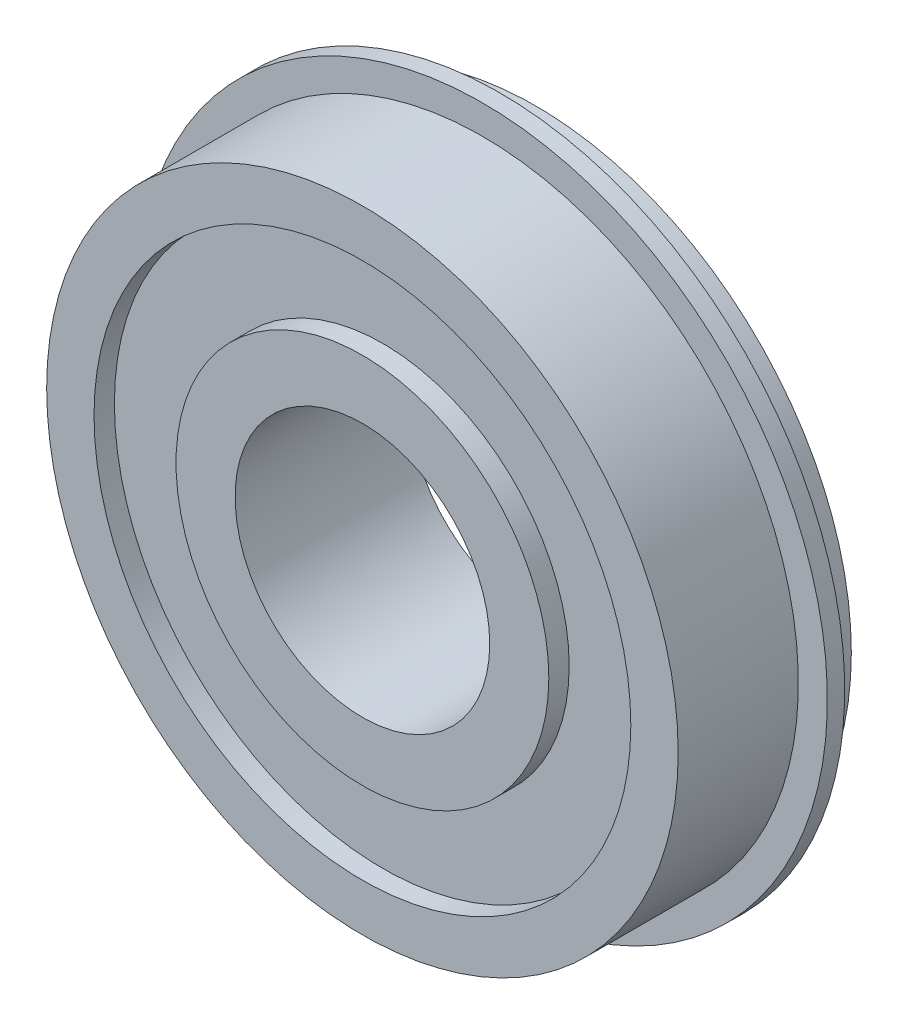
ISO-10303-21;
HEADER;
FILE_DESCRIPTION(('STEP AP214'),'2;1');
FILE_NAME('part.step','',(''),(''),'','','');
FILE_SCHEMA(('AUTOMOTIVE_DESIGN { 1 0 10303 214 1 1 1 1 }'));
ENDSEC;
DATA;
#1=APPLICATION_CONTEXT('core data for automotive mechanical design processes');
#2=APPLICATION_PROTOCOL_DEFINITION('international standard','automotive_design',2000,#1);
#3=PRODUCT_CONTEXT('',#1,'mechanical');
#4=PRODUCT('Part','Part','',(#3));
#5=PRODUCT_RELATED_PRODUCT_CATEGORY('part','',(#4));
#6=PRODUCT_DEFINITION_FORMATION('','',#4);
#7=PRODUCT_DEFINITION_CONTEXT('part definition',#1,'design');
#8=PRODUCT_DEFINITION('design','',#6,#7);
#9=PRODUCT_DEFINITION_SHAPE('','',#8);
#10=(LENGTH_UNIT() NAMED_UNIT(*) SI_UNIT(.MILLI.,.METRE.));
#11=(NAMED_UNIT(*) PLANE_ANGLE_UNIT() SI_UNIT($,.RADIAN.));
#12=(NAMED_UNIT(*) SI_UNIT($,.STERADIAN.) SOLID_ANGLE_UNIT());
#13=UNCERTAINTY_MEASURE_WITH_UNIT(LENGTH_MEASURE(1.E-05),#10,'distance_accuracy_value','');
#14=(GEOMETRIC_REPRESENTATION_CONTEXT(3) GLOBAL_UNCERTAINTY_ASSIGNED_CONTEXT((#13)) GLOBAL_UNIT_ASSIGNED_CONTEXT((#10,
#11,#12)) REPRESENTATION_CONTEXT('',''));
#15=CARTESIAN_POINT('',(0.,0.,0.));
#16=DIRECTION('',(0.,0.,1.));
#17=DIRECTION('',(1.,0.,0.));
#18=AXIS2_PLACEMENT_3D('',#15,#16,#17);
#19=CARTESIAN_POINT('',(0.,0.,8.5));
#20=DIRECTION('',(0.,0.,-1.));
#21=DIRECTION('',(-1.,0.,0.));
#22=AXIS2_PLACEMENT_3D('',#19,#20,#21);
#23=CYLINDRICAL_SURFACE('',#22,31.);
#24=CARTESIAN_POINT('',(0.,0.,8.5));
#25=DIRECTION('',(0.,0.,1.));
#26=DIRECTION('',(1.,0.,0.));
#27=AXIS2_PLACEMENT_3D('',#24,#25,#26);
#28=CIRCLE('',#27,31.);
#29=CARTESIAN_POINT('',(31.,0.,8.5));
#30=VERTEX_POINT('',#29);
#31=EDGE_CURVE('E43',#30,#30,#28,.T.);
#32=ORIENTED_EDGE('',*,*,#31,.F.);
#33=EDGE_LOOP('',(#32));
#34=FACE_BOUND('',#33,.T.);
#35=CARTESIAN_POINT('',(0.,0.,-3.3));
#36=DIRECTION('',(0.,0.,-1.));
#37=DIRECTION('',(-1.,0.,0.));
#38=AXIS2_PLACEMENT_3D('',#35,#36,#37);
#39=CIRCLE('',#38,31.);
#40=CARTESIAN_POINT('',(-31.,0.,-3.3));
#41=VERTEX_POINT('',#40);
#42=EDGE_CURVE('E10',#41,#41,#39,.T.);
#43=ORIENTED_EDGE('',*,*,#42,.F.);
#44=EDGE_LOOP('',(#43));
#45=FACE_BOUND('',#44,.T.);
#46=ADVANCED_FACE('F36',(#34,#45),#23,.T.);
#47=CARTESIAN_POINT('',(0.,0.,-8.5));
#48=DIRECTION('',(0.,0.,1.));
#49=DIRECTION('',(1.,0.,0.));
#50=AXIS2_PLACEMENT_3D('',#47,#48,#49);
#51=PLANE('',#50);
#52=CARTESIAN_POINT('',(0.,0.,-8.5));
#53=DIRECTION('',(0.,0.,1.));
#54=DIRECTION('',(1.,0.,0.));
#55=AXIS2_PLACEMENT_3D('',#52,#53,#54);
#56=CIRCLE('',#55,12.5);
#57=CARTESIAN_POINT('',(12.5,0.,-8.5));
#58=VERTEX_POINT('',#57);
#59=EDGE_CURVE('E54',#58,#58,#56,.T.);
#60=ORIENTED_EDGE('',*,*,#59,.T.);
#61=EDGE_LOOP('',(#60));
#62=FACE_BOUND('',#61,.T.);
#63=CARTESIAN_POINT('',(0.,0.,-8.5));
#64=DIRECTION('',(0.,0.,1.));
#65=DIRECTION('',(1.,0.,0.));
#66=AXIS2_PLACEMENT_3D('',#63,#64,#65);
#67=CIRCLE('',#66,18.3);
#68=CARTESIAN_POINT('',(18.3,0.,-8.5));
#69=VERTEX_POINT('',#68);
#70=EDGE_CURVE('E78',#69,#69,#67,.T.);
#71=ORIENTED_EDGE('',*,*,#70,.F.);
#72=EDGE_LOOP('',(#71));
#73=FACE_BOUND('',#72,.T.);
#74=ADVANCED_FACE('F116',(#62,#73),#51,.F.);
#75=CARTESIAN_POINT('',(0.,0.,8.5));
#76=DIRECTION('',(0.,0.,1.));
#77=DIRECTION('',(1.,0.,0.));
#78=AXIS2_PLACEMENT_3D('',#75,#76,#77);
#79=PLANE('',#78);
#80=CARTESIAN_POINT('',(0.,0.,8.5));
#81=DIRECTION('',(0.,0.,1.));
#82=DIRECTION('',(1.,0.,0.));
#83=AXIS2_PLACEMENT_3D('',#80,#81,#82);
#84=CIRCLE('',#83,12.5);
#85=CARTESIAN_POINT('',(12.5,0.,8.5));
#86=VERTEX_POINT('',#85);
#87=EDGE_CURVE('E52',#86,#86,#84,.T.);
#88=ORIENTED_EDGE('',*,*,#87,.F.);
#89=EDGE_LOOP('',(#88));
#90=FACE_BOUND('',#89,.T.);
#91=CARTESIAN_POINT('',(0.,0.,8.5));
#92=DIRECTION('',(0.,0.,1.));
#93=DIRECTION('',(1.,0.,0.));
#94=AXIS2_PLACEMENT_3D('',#91,#92,#93);
#95=CIRCLE('',#94,18.3);
#96=CARTESIAN_POINT('',(18.3,0.,8.5));
#97=VERTEX_POINT('',#96);
#98=EDGE_CURVE('E66',#97,#97,#95,.T.);
#99=ORIENTED_EDGE('',*,*,#98,.T.);
#100=EDGE_LOOP('',(#99));
#101=FACE_BOUND('',#100,.T.);
#102=ADVANCED_FACE('F121',(#90,#101),#79,.T.);
#103=CARTESIAN_POINT('',(0.,0.,8.5));
#104=DIRECTION('',(0.,0.,1.));
#105=DIRECTION('',(1.,0.,0.));
#106=AXIS2_PLACEMENT_3D('',#103,#104,#105);
#107=CIRCLE('',#106,26.35);
#108=CARTESIAN_POINT('',(26.35,0.,8.5));
#109=VERTEX_POINT('',#108);
#110=EDGE_CURVE('E60',#109,#109,#107,.T.);
#111=ORIENTED_EDGE('',*,*,#110,.F.);
#112=EDGE_LOOP('',(#111));
#113=FACE_BOUND('',#112,.T.);
#114=ORIENTED_EDGE('',*,*,#31,.T.);
#115=EDGE_LOOP('',(#114));
#116=FACE_BOUND('',#115,.T.);
#117=ADVANCED_FACE('F134',(#113,#116),#79,.T.);
#118=CARTESIAN_POINT('',(0.,0.,-8.5));
#119=DIRECTION('',(0.,0.,1.));
#120=DIRECTION('',(1.,0.,0.));
#121=AXIS2_PLACEMENT_3D('',#118,#119,#120);
#122=CIRCLE('',#121,26.35);
#123=CARTESIAN_POINT('',(26.35,0.,-8.5));
#124=VERTEX_POINT('',#123);
#125=EDGE_CURVE('E72',#124,#124,#122,.T.);
#126=ORIENTED_EDGE('',*,*,#125,.T.);
#127=EDGE_LOOP('',(#126));
#128=FACE_BOUND('',#127,.T.);
#129=CARTESIAN_POINT('',(0.,0.,-8.5));
#130=DIRECTION('',(0.,0.,1.));
#131=DIRECTION('',(1.,0.,0.));
#132=AXIS2_PLACEMENT_3D('',#129,#130,#131);
#133=CIRCLE('',#132,31.);
#134=CARTESIAN_POINT('',(31.,0.,-8.5));
#135=VERTEX_POINT('',#134);
#136=EDGE_CURVE('E47',#135,#135,#133,.T.);
#137=ORIENTED_EDGE('',*,*,#136,.F.);
#138=EDGE_LOOP('',(#137));
#139=FACE_BOUND('',#138,.T.);
#140=ADVANCED_FACE('F123',(#128,#139),#51,.F.);
#141=CARTESIAN_POINT('',(0.,0.,-5.));
#142=DIRECTION('',(0.,0.,-1.));
#143=DIRECTION('',(-1.,0.,0.));
#144=AXIS2_PLACEMENT_3D('',#141,#142,#143);
#145=CIRCLE('',#144,31.);
#146=CARTESIAN_POINT('',(-31.,0.,-5.));
#147=VERTEX_POINT('',#146);
#148=EDGE_CURVE('E87',#147,#147,#145,.T.);
#149=ORIENTED_EDGE('',*,*,#148,.T.);
#150=EDGE_LOOP('',(#149));
#151=FACE_BOUND('',#150,.T.);
#152=ORIENTED_EDGE('',*,*,#136,.T.);
#153=EDGE_LOOP('',(#152));
#154=FACE_BOUND('',#153,.T.);
#155=ADVANCED_FACE('F38',(#151,#154),#23,.T.);
#156=CARTESIAN_POINT('',(0.,0.,8.5));
#157=DIRECTION('',(0.,0.,-1.));
#158=DIRECTION('',(-1.,0.,0.));
#159=AXIS2_PLACEMENT_3D('',#156,#157,#158);
#160=CYLINDRICAL_SURFACE('',#159,12.5);
#161=ORIENTED_EDGE('',*,*,#87,.T.);
#162=EDGE_LOOP('',(#161));
#163=FACE_BOUND('',#162,.T.);
#164=ORIENTED_EDGE('',*,*,#59,.F.);
#165=EDGE_LOOP('',(#164));
#166=FACE_BOUND('',#165,.T.);
#167=ADVANCED_FACE('F126',(#163,#166),#160,.F.);
#168=CARTESIAN_POINT('',(0.,0.,6.5));
#169=DIRECTION('',(0.,0.,1.));
#170=DIRECTION('',(1.,0.,0.));
#171=AXIS2_PLACEMENT_3D('',#168,#169,#170);
#172=CYLINDRICAL_SURFACE('',#171,26.35);
#173=CARTESIAN_POINT('',(0.,0.,6.5));
#174=DIRECTION('',(0.,0.,1.));
#175=DIRECTION('',(1.,0.,0.));
#176=AXIS2_PLACEMENT_3D('',#173,#174,#175);
#177=CIRCLE('',#176,26.35);
#178=CARTESIAN_POINT('',(26.35,0.,6.5));
#179=VERTEX_POINT('',#178);
#180=EDGE_CURVE('E57',#179,#179,#177,.T.);
#181=ORIENTED_EDGE('',*,*,#180,.F.);
#182=EDGE_LOOP('',(#181));
#183=FACE_BOUND('',#182,.T.);
#184=ORIENTED_EDGE('',*,*,#110,.T.);
#185=EDGE_LOOP('',(#184));
#186=FACE_BOUND('',#185,.T.);
#187=ADVANCED_FACE('F131',(#183,#186),#172,.F.);
#188=CARTESIAN_POINT('',(0.,0.,6.5));
#189=DIRECTION('',(0.,0.,1.));
#190=DIRECTION('',(1.,0.,0.));
#191=AXIS2_PLACEMENT_3D('',#188,#189,#190);
#192=PLANE('',#191);
#193=CARTESIAN_POINT('',(0.,0.,6.5));
#194=DIRECTION('',(0.,0.,1.));
#195=DIRECTION('',(1.,0.,0.));
#196=AXIS2_PLACEMENT_3D('',#193,#194,#195);
#197=CIRCLE('',#196,18.3);
#198=CARTESIAN_POINT('',(18.3,0.,6.5));
#199=VERTEX_POINT('',#198);
#200=EDGE_CURVE('E63',#199,#199,#197,.T.);
#201=ORIENTED_EDGE('',*,*,#200,.F.);
#202=EDGE_LOOP('',(#201));
#203=FACE_BOUND('',#202,.T.);
#204=ORIENTED_EDGE('',*,*,#180,.T.);
#205=EDGE_LOOP('',(#204));
#206=FACE_BOUND('',#205,.T.);
#207=ADVANCED_FACE('F145',(#203,#206),#192,.T.);
#208=CARTESIAN_POINT('',(0.,0.,6.5));
#209=DIRECTION('',(0.,0.,1.));
#210=DIRECTION('',(1.,0.,0.));
#211=AXIS2_PLACEMENT_3D('',#208,#209,#210);
#212=CYLINDRICAL_SURFACE('',#211,18.3);
#213=ORIENTED_EDGE('',*,*,#200,.T.);
#214=EDGE_LOOP('',(#213));
#215=FACE_BOUND('',#214,.T.);
#216=ORIENTED_EDGE('',*,*,#98,.F.);
#217=EDGE_LOOP('',(#216));
#218=FACE_BOUND('',#217,.T.);
#219=ADVANCED_FACE('F149',(#215,#218),#212,.T.);
#220=CARTESIAN_POINT('',(0.,0.,-6.5));
#221=DIRECTION('',(0.,0.,-1.));
#222=DIRECTION('',(1.,0.,0.));
#223=AXIS2_PLACEMENT_3D('',#220,#221,#222);
#224=PLANE('',#223);
#225=CARTESIAN_POINT('',(0.,0.,-6.5));
#226=DIRECTION('',(0.,0.,1.));
#227=DIRECTION('',(1.,0.,0.));
#228=AXIS2_PLACEMENT_3D('',#225,#226,#227);
#229=CIRCLE('',#228,26.35);
#230=CARTESIAN_POINT('',(26.35,0.,-6.5));
#231=VERTEX_POINT('',#230);
#232=EDGE_CURVE('E69',#231,#231,#229,.T.);
#233=ORIENTED_EDGE('',*,*,#232,.F.);
#234=EDGE_LOOP('',(#233));
#235=FACE_BOUND('',#234,.T.);
#236=CARTESIAN_POINT('',(0.,0.,-6.5));
#237=DIRECTION('',(0.,0.,1.));
#238=DIRECTION('',(1.,0.,0.));
#239=AXIS2_PLACEMENT_3D('',#236,#237,#238);
#240=CIRCLE('',#239,18.3);
#241=CARTESIAN_POINT('',(18.3,0.,-6.5));
#242=VERTEX_POINT('',#241);
#243=EDGE_CURVE('E75',#242,#242,#240,.T.);
#244=ORIENTED_EDGE('',*,*,#243,.T.);
#245=EDGE_LOOP('',(#244));
#246=FACE_BOUND('',#245,.T.);
#247=ADVANCED_FACE('F153',(#235,#246),#224,.T.);
#248=CARTESIAN_POINT('',(0.,0.,-6.5));
#249=DIRECTION('',(0.,0.,-1.));
#250=DIRECTION('',(-1.,0.,0.));
#251=AXIS2_PLACEMENT_3D('',#248,#249,#250);
#252=CYLINDRICAL_SURFACE('',#251,26.35);
#253=ORIENTED_EDGE('',*,*,#232,.T.);
#254=EDGE_LOOP('',(#253));
#255=FACE_BOUND('',#254,.T.);
#256=ORIENTED_EDGE('',*,*,#125,.F.);
#257=EDGE_LOOP('',(#256));
#258=FACE_BOUND('',#257,.T.);
#259=ADVANCED_FACE('F112',(#255,#258),#252,.F.);
#260=CARTESIAN_POINT('',(0.,0.,-6.5));
#261=DIRECTION('',(0.,0.,-1.));
#262=DIRECTION('',(-1.,0.,0.));
#263=AXIS2_PLACEMENT_3D('',#260,#261,#262);
#264=CYLINDRICAL_SURFACE('',#263,18.3);
#265=ORIENTED_EDGE('',*,*,#243,.F.);
#266=EDGE_LOOP('',(#265));
#267=FACE_BOUND('',#266,.T.);
#268=ORIENTED_EDGE('',*,*,#70,.T.);
#269=EDGE_LOOP('',(#268));
#270=FACE_BOUND('',#269,.T.);
#271=ADVANCED_FACE('F104',(#267,#270),#264,.T.);
#272=CARTESIAN_POINT('',(0.,0.,-3.3));
#273=DIRECTION('',(0.,0.,-1.));
#274=DIRECTION('',(-1.,0.,0.));
#275=AXIS2_PLACEMENT_3D('',#272,#273,#274);
#276=CYLINDRICAL_SURFACE('',#275,33.85);
#277=CARTESIAN_POINT('',(0.,0.,-3.3));
#278=DIRECTION('',(0.,0.,-1.));
#279=DIRECTION('',(-1.,0.,0.));
#280=AXIS2_PLACEMENT_3D('',#277,#278,#279);
#281=CIRCLE('',#280,33.85);
#282=CARTESIAN_POINT('',(-33.85,0.,-3.3));
#283=VERTEX_POINT('',#282);
#284=EDGE_CURVE('E81',#283,#283,#281,.T.);
#285=ORIENTED_EDGE('',*,*,#284,.T.);
#286=EDGE_LOOP('',(#285));
#287=FACE_BOUND('',#286,.T.);
#288=CARTESIAN_POINT('',(0.,0.,-5.));
#289=DIRECTION('',(0.,0.,-1.));
#290=DIRECTION('',(-1.,0.,0.));
#291=AXIS2_PLACEMENT_3D('',#288,#289,#290);
#292=CIRCLE('',#291,33.85);
#293=CARTESIAN_POINT('',(-33.85,0.,-5.));
#294=VERTEX_POINT('',#293);
#295=EDGE_CURVE('E84',#294,#294,#292,.T.);
#296=ORIENTED_EDGE('',*,*,#295,.F.);
#297=EDGE_LOOP('',(#296));
#298=FACE_BOUND('',#297,.T.);
#299=ADVANCED_FACE('F102',(#287,#298),#276,.T.);
#300=CARTESIAN_POINT('',(0.,0.,-3.3));
#301=DIRECTION('',(0.,0.,-1.));
#302=DIRECTION('',(-1.,0.,0.));
#303=AXIS2_PLACEMENT_3D('',#300,#301,#302);
#304=PLANE('',#303);
#305=ORIENTED_EDGE('',*,*,#42,.T.);
#306=EDGE_LOOP('',(#305));
#307=FACE_BOUND('',#306,.T.);
#308=ORIENTED_EDGE('',*,*,#284,.F.);
#309=EDGE_LOOP('',(#308));
#310=FACE_BOUND('',#309,.T.);
#311=ADVANCED_FACE('F98',(#307,#310),#304,.F.);
#312=CARTESIAN_POINT('',(0.,0.,-5.));
#313=DIRECTION('',(0.,0.,-1.));
#314=DIRECTION('',(-1.,0.,0.));
#315=AXIS2_PLACEMENT_3D('',#312,#313,#314);
#316=PLANE('',#315);
#317=ORIENTED_EDGE('',*,*,#148,.F.);
#318=EDGE_LOOP('',(#317));
#319=FACE_BOUND('',#318,.T.);
#320=ORIENTED_EDGE('',*,*,#295,.T.);
#321=EDGE_LOOP('',(#320));
#322=FACE_BOUND('',#321,.T.);
#323=ADVANCED_FACE('F95',(#319,#322),#316,.T.);
#324=CLOSED_SHELL('',(#46,#74,#102,#117,#140,#155,#167,#187,#207,#219,#247,#259,#271,#299,#311,#323));
#325=MANIFOLD_SOLID_BREP('B2',#324);
#326=ADVANCED_BREP_SHAPE_REPRESENTATION('',(#18,#325),#14);
#327=SHAPE_DEFINITION_REPRESENTATION(#9,#326);
ENDSEC;
END-ISO-10303-21;
